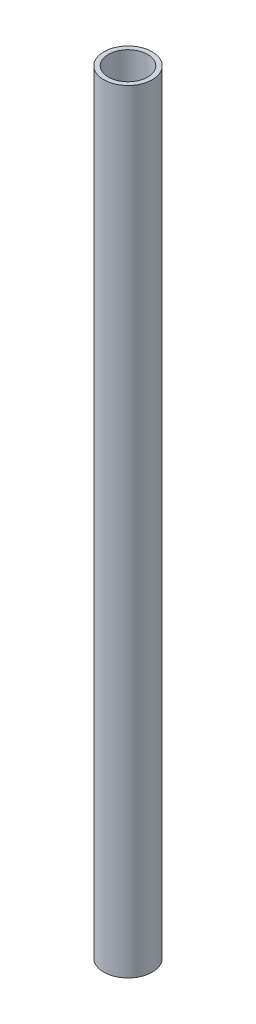
ISO-10303-21;
HEADER;
FILE_DESCRIPTION(('STEP AP214'),'2;1');
FILE_NAME('part.step','',(''),(''),'','','');
FILE_SCHEMA(('AUTOMOTIVE_DESIGN { 1 0 10303 214 1 1 1 1 }'));
ENDSEC;
DATA;
#1=APPLICATION_CONTEXT('core data for automotive mechanical design processes');
#2=APPLICATION_PROTOCOL_DEFINITION('international standard','automotive_design',2000,#1);
#3=PRODUCT_CONTEXT('',#1,'mechanical');
#4=PRODUCT('Part','Part','',(#3));
#5=PRODUCT_RELATED_PRODUCT_CATEGORY('part','',(#4));
#6=PRODUCT_DEFINITION_FORMATION('','',#4);
#7=PRODUCT_DEFINITION_CONTEXT('part definition',#1,'design');
#8=PRODUCT_DEFINITION('design','',#6,#7);
#9=PRODUCT_DEFINITION_SHAPE('','',#8);
#10=(LENGTH_UNIT() NAMED_UNIT(*) SI_UNIT(.MILLI.,.METRE.));
#11=(NAMED_UNIT(*) PLANE_ANGLE_UNIT() SI_UNIT($,.RADIAN.));
#12=(NAMED_UNIT(*) SI_UNIT($,.STERADIAN.) SOLID_ANGLE_UNIT());
#13=UNCERTAINTY_MEASURE_WITH_UNIT(LENGTH_MEASURE(1.E-05),#10,'distance_accuracy_value','');
#14=(GEOMETRIC_REPRESENTATION_CONTEXT(3) GLOBAL_UNCERTAINTY_ASSIGNED_CONTEXT((#13)) GLOBAL_UNIT_ASSIGNED_CONTEXT((#10,
#11,#12)) REPRESENTATION_CONTEXT('',''));
#15=CARTESIAN_POINT('',(0.,0.,0.));
#16=DIRECTION('',(0.,0.,1.));
#17=DIRECTION('',(1.,0.,0.));
#18=AXIS2_PLACEMENT_3D('',#15,#16,#17);
#19=CARTESIAN_POINT('',(2.46348080823466E-11,340.,1.49999999999998));
#20=DIRECTION('',(0.,1.,0.));
#21=DIRECTION('',(0.,0.,1.));
#22=AXIS2_PLACEMENT_3D('',#19,#20,#21);
#23=PLANE('',#22);
#24=CARTESIAN_POINT('',(2.46348080823466E-11,340.,1.49999999999998));
#25=DIRECTION('',(0.,1.,0.));
#26=DIRECTION('',(0.,0.,1.));
#27=AXIS2_PLACEMENT_3D('',#24,#25,#26);
#28=CIRCLE('',#27,10.65);
#29=CARTESIAN_POINT('',(2.46245083785498E-11,340.,-9.15000000000001));
#30=VERTEX_POINT('',#29);
#31=EDGE_CURVE('E12',#30,#30,#28,.T.);
#32=ORIENTED_EDGE('',*,*,#31,.T.);
#33=EDGE_LOOP('',(#32));
#34=FACE_BOUND('',#33,.T.);
#35=CARTESIAN_POINT('',(2.46348080823466E-11,340.,1.49999999999998));
#36=DIRECTION('',(0.,1.,0.));
#37=DIRECTION('',(0.,0.,1.));
#38=AXIS2_PLACEMENT_3D('',#35,#36,#37);
#39=CIRCLE('',#38,8.65);
#40=CARTESIAN_POINT('',(2.46264425952253E-11,340.,-7.15000000000002));
#41=VERTEX_POINT('',#40);
#42=EDGE_CURVE('E60',#41,#41,#39,.T.);
#43=ORIENTED_EDGE('',*,*,#42,.F.);
#44=EDGE_LOOP('',(#43));
#45=FACE_BOUND('',#44,.T.);
#46=ADVANCED_FACE('F46',(#34,#45),#23,.T.);
#47=CARTESIAN_POINT('',(2.45914399954472E-11,0.,1.50000000000002));
#48=DIRECTION('',(0.,1.,0.));
#49=DIRECTION('',(0.,0.,1.));
#50=AXIS2_PLACEMENT_3D('',#47,#48,#49);
#51=PLANE('',#50);
#52=CARTESIAN_POINT('',(2.45914399954472E-11,0.,1.50000000000002));
#53=DIRECTION('',(0.,1.,0.));
#54=DIRECTION('',(0.,0.,1.));
#55=AXIS2_PLACEMENT_3D('',#52,#53,#54);
#56=CIRCLE('',#55,10.65);
#57=CARTESIAN_POINT('',(2.4583777230912E-11,0.,-9.15));
#58=VERTEX_POINT('',#57);
#59=EDGE_CURVE('E50',#58,#58,#56,.T.);
#60=ORIENTED_EDGE('',*,*,#59,.F.);
#61=EDGE_LOOP('',(#60));
#62=FACE_BOUND('',#61,.T.);
#63=CARTESIAN_POINT('',(2.45914399954472E-11,0.,1.50000000000002));
#64=DIRECTION('',(0.,1.,0.));
#65=DIRECTION('',(0.,0.,1.));
#66=AXIS2_PLACEMENT_3D('',#63,#64,#65);
#67=CIRCLE('',#66,8.65);
#68=CARTESIAN_POINT('',(2.45857114475875E-11,0.,-7.15));
#69=VERTEX_POINT('',#68);
#70=EDGE_CURVE('E62',#69,#69,#67,.T.);
#71=ORIENTED_EDGE('',*,*,#70,.T.);
#72=EDGE_LOOP('',(#71));
#73=FACE_BOUND('',#72,.T.);
#74=ADVANCED_FACE('F75',(#62,#73),#51,.F.);
#75=CARTESIAN_POINT('',(2.46348080823466E-11,340.,1.49999999999998));
#76=DIRECTION('',(0.,-1.,0.));
#77=DIRECTION('',(0.,0.,-1.));
#78=AXIS2_PLACEMENT_3D('',#75,#76,#77);
#79=CYLINDRICAL_SURFACE('',#78,10.65);
#80=CARTESIAN_POINT('',(2.46245083785498E-11,340.,-9.15000000000001));
#81=CARTESIAN_POINT('',(2.46240840957619E-11,336.458333333333,-9.15000000000001));
#82=CARTESIAN_POINT('',(2.4623659812974E-11,332.916666666667,-9.15000000000001));
#83=CARTESIAN_POINT('',(2.46228112473983E-11,325.833333333333,-9.15000000000001));
#84=CARTESIAN_POINT('',(2.46223869646104E-11,322.291666666667,-9.15000000000001));
#85=CARTESIAN_POINT('',(2.46215383990346E-11,315.208333333333,-9.15000000000001));
#86=CARTESIAN_POINT('',(2.46211141162467E-11,311.666666666667,-9.15000000000001));
#87=CARTESIAN_POINT('',(2.46202655506709E-11,304.583333333333,-9.15000000000001));
#88=CARTESIAN_POINT('',(2.4619841267883E-11,301.041666666667,-9.15000000000001));
#89=CARTESIAN_POINT('',(2.46189927023072E-11,293.958333333333,-9.15000000000001));
#90=CARTESIAN_POINT('',(2.46185684195193E-11,290.416666666667,-9.15000000000001));
#91=CARTESIAN_POINT('',(2.46177198539435E-11,283.333333333333,-9.15000000000001));
#92=CARTESIAN_POINT('',(2.46172955711556E-11,279.791666666667,-9.15000000000001));
#93=CARTESIAN_POINT('',(2.46164470055799E-11,272.708333333333,-9.15000000000001));
#94=CARTESIAN_POINT('',(2.4616022722792E-11,269.166666666667,-9.15000000000001));
#95=CARTESIAN_POINT('',(2.46151741572162E-11,262.083333333333,-9.15000000000001));
#96=CARTESIAN_POINT('',(2.46147498744283E-11,258.541666666667,-9.15000000000001));
#97=CARTESIAN_POINT('',(2.46139013088525E-11,251.458333333333,-9.15000000000001));
#98=CARTESIAN_POINT('',(2.46134770260646E-11,247.916666666667,-9.15000000000001));
#99=CARTESIAN_POINT('',(2.46126284604888E-11,240.833333333333,-9.15000000000001));
#100=CARTESIAN_POINT('',(2.46122041777009E-11,237.291666666667,-9.15000000000001));
#101=CARTESIAN_POINT('',(2.46113556121251E-11,230.208333333333,-9.15000000000001));
#102=CARTESIAN_POINT('',(2.46109313293372E-11,226.666666666667,-9.15000000000001));
#103=CARTESIAN_POINT('',(2.46100827637614E-11,219.583333333333,-9.15000000000001));
#104=CARTESIAN_POINT('',(2.46096584809735E-11,216.041666666667,-9.15000000000001));
#105=CARTESIAN_POINT('',(2.46088099153978E-11,208.958333333333,-9.15000000000001));
#106=CARTESIAN_POINT('',(2.46083856326099E-11,205.416666666667,-9.15000000000001));
#107=CARTESIAN_POINT('',(2.46075370670341E-11,198.333333333333,-9.15000000000001));
#108=CARTESIAN_POINT('',(2.46071127842462E-11,194.791666666667,-9.15000000000001));
#109=CARTESIAN_POINT('',(2.46062642186704E-11,187.708333333333,-9.15000000000001));
#110=CARTESIAN_POINT('',(2.46058399358825E-11,184.166666666667,-9.15000000000001));
#111=CARTESIAN_POINT('',(2.46049913703067E-11,177.083333333333,-9.15000000000001));
#112=CARTESIAN_POINT('',(2.46045670875188E-11,173.541666666667,-9.15000000000001));
#113=CARTESIAN_POINT('',(2.4603718521943E-11,166.458333333333,-9.15000000000001));
#114=CARTESIAN_POINT('',(2.46032942391551E-11,162.916666666667,-9.15000000000001));
#115=CARTESIAN_POINT('',(2.46024456735794E-11,155.833333333333,-9.15000000000001));
#116=CARTESIAN_POINT('',(2.46020213907915E-11,152.291666666667,-9.15000000000001));
#117=CARTESIAN_POINT('',(2.46011728252157E-11,145.208333333333,-9.15000000000001));
#118=CARTESIAN_POINT('',(2.46007485424278E-11,141.666666666667,-9.15000000000001));
#119=CARTESIAN_POINT('',(2.4599899976852E-11,134.583333333333,-9.15000000000001));
#120=CARTESIAN_POINT('',(2.45994756940641E-11,131.041666666667,-9.15));
#121=CARTESIAN_POINT('',(2.45986271284883E-11,123.958333333333,-9.15));
#122=CARTESIAN_POINT('',(2.45982028457004E-11,120.416666666667,-9.15));
#123=CARTESIAN_POINT('',(2.45973542801246E-11,113.333333333333,-9.15));
#124=CARTESIAN_POINT('',(2.45969299973367E-11,109.791666666667,-9.15));
#125=CARTESIAN_POINT('',(2.45960814317609E-11,102.708333333333,-9.15));
#126=CARTESIAN_POINT('',(2.4595657148973E-11,99.1666666666667,-9.15));
#127=CARTESIAN_POINT('',(2.45948085833973E-11,92.0833333333334,-9.15));
#128=CARTESIAN_POINT('',(2.45943843006094E-11,88.5416666666667,-9.15));
#129=CARTESIAN_POINT('',(2.45935357350336E-11,81.4583333333334,-9.15));
#130=CARTESIAN_POINT('',(2.45931114522457E-11,77.9166666666667,-9.15));
#131=CARTESIAN_POINT('',(2.45922628866699E-11,70.8333333333334,-9.15));
#132=CARTESIAN_POINT('',(2.4591838603882E-11,67.2916666666667,-9.15));
#133=CARTESIAN_POINT('',(2.45909900383062E-11,60.2083333333333,-9.15));
#134=CARTESIAN_POINT('',(2.45905657555183E-11,56.6666666666667,-9.15));
#135=CARTESIAN_POINT('',(2.45897171899425E-11,49.5833333333333,-9.15));
#136=CARTESIAN_POINT('',(2.45892929071546E-11,46.0416666666667,-9.15));
#137=CARTESIAN_POINT('',(2.45884443415789E-11,38.9583333333333,-9.15));
#138=CARTESIAN_POINT('',(2.4588020058791E-11,35.4166666666667,-9.15));
#139=CARTESIAN_POINT('',(2.45871714932152E-11,28.3333333333333,-9.15));
#140=CARTESIAN_POINT('',(2.45867472104273E-11,24.7916666666667,-9.15));
#141=CARTESIAN_POINT('',(2.45858986448515E-11,17.7083333333333,-9.15));
#142=CARTESIAN_POINT('',(2.45854743620636E-11,14.1666666666667,-9.15));
#143=CARTESIAN_POINT('',(2.45846257964878E-11,7.08333333333333,-9.15));
#144=CARTESIAN_POINT('',(2.45842015136999E-11,3.54166666666667,-9.15));
#145=CARTESIAN_POINT('',(2.4583777230912E-11,0.,-9.15));
#146=B_SPLINE_CURVE_WITH_KNOTS('',3,(#80,#81,#82,#83,#84,#85,#86,#87,#88,#89,#90,#91,#92,#93,
#94,#95,#96,#97,#98,#99,#100,#101,#102,#103,#104,#105,#106,#107,#108,#109,#110,#111,#112,#113,
#114,#115,#116,#117,#118,#119,#120,#121,#122,#123,#124,#125,#126,#127,#128,#129,#130,#131,#132,
#133,#134,#135,#136,#137,#138,#139,#140,#141,#142,#143,#144,#145),.UNSPECIFIED.,.F.,.F.,(4,2,2,
2,2,2,2,2,2,2,2,2,2,2,2,2,2,2,2,2,2,2,2,2,2,2,2,2,2,2,2,2,4),(0.,10.625,21.25,31.8749999999999,
42.5,53.125,63.7499999999999,74.375,85.,95.625,106.25,116.875,127.5,138.125,148.75,159.375,170.,
180.625,191.25,201.875,212.5,223.125,233.75,244.375,255.,265.625,276.25,286.875,297.5,308.125,
318.75,329.375,340.),.UNSPECIFIED.);
#147=EDGE_CURVE('BSEAM48',#30,#58,#146,.T.);
#148=ORIENTED_EDGE('',*,*,#31,.F.);
#149=ORIENTED_EDGE('',*,*,#59,.T.);
#150=ORIENTED_EDGE('',*,*,#147,.T.);
#151=ORIENTED_EDGE('',*,*,#147,.F.);
#152=EDGE_LOOP('',(#148,#150,#149,#151));
#153=FACE_BOUND('',#152,.T.);
#154=ADVANCED_FACE('F48',(#153),#79,.T.);
#155=CARTESIAN_POINT('',(2.46348080823466E-11,340.,1.49999999999998));
#156=DIRECTION('',(0.,-1.,0.));
#157=DIRECTION('',(0.,0.,-1.));
#158=AXIS2_PLACEMENT_3D('',#155,#156,#157);
#159=CYLINDRICAL_SURFACE('',#158,8.65);
#160=CARTESIAN_POINT('',(2.46264425952253E-11,340.,-7.15000000000002));
#161=CARTESIAN_POINT('',(2.46260183124374E-11,336.458333333333,-7.15000000000001));
#162=CARTESIAN_POINT('',(2.46255940296495E-11,332.916666666667,-7.15000000000001));
#163=CARTESIAN_POINT('',(2.46247454640737E-11,325.833333333333,-7.15000000000001));
#164=CARTESIAN_POINT('',(2.46243211812858E-11,322.291666666667,-7.15000000000001));
#165=CARTESIAN_POINT('',(2.462347261571E-11,315.208333333333,-7.15000000000001));
#166=CARTESIAN_POINT('',(2.46230483329221E-11,311.666666666667,-7.15000000000001));
#167=CARTESIAN_POINT('',(2.46221997673464E-11,304.583333333333,-7.15000000000001));
#168=CARTESIAN_POINT('',(2.46217754845585E-11,301.041666666667,-7.15000000000001));
#169=CARTESIAN_POINT('',(2.46209269189827E-11,293.958333333333,-7.15000000000001));
#170=CARTESIAN_POINT('',(2.46205026361948E-11,290.416666666667,-7.15000000000001));
#171=CARTESIAN_POINT('',(2.4619654070619E-11,283.333333333333,-7.15000000000001));
#172=CARTESIAN_POINT('',(2.46192297878311E-11,279.791666666667,-7.15000000000001));
#173=CARTESIAN_POINT('',(2.46183812222553E-11,272.708333333333,-7.15000000000001));
#174=CARTESIAN_POINT('',(2.46179569394674E-11,269.166666666667,-7.15000000000001));
#175=CARTESIAN_POINT('',(2.46171083738916E-11,262.083333333333,-7.15000000000001));
#176=CARTESIAN_POINT('',(2.46166840911037E-11,258.541666666667,-7.15000000000001));
#177=CARTESIAN_POINT('',(2.46158355255279E-11,251.458333333333,-7.15000000000001));
#178=CARTESIAN_POINT('',(2.461541124274E-11,247.916666666667,-7.15000000000001));
#179=CARTESIAN_POINT('',(2.46145626771643E-11,240.833333333333,-7.15000000000001));
#180=CARTESIAN_POINT('',(2.46141383943764E-11,237.291666666667,-7.15000000000001));
#181=CARTESIAN_POINT('',(2.46132898288006E-11,230.208333333333,-7.15000000000001));
#182=CARTESIAN_POINT('',(2.46128655460127E-11,226.666666666667,-7.15000000000001));
#183=CARTESIAN_POINT('',(2.46120169804369E-11,219.583333333333,-7.15000000000001));
#184=CARTESIAN_POINT('',(2.4611592697649E-11,216.041666666667,-7.15000000000001));
#185=CARTESIAN_POINT('',(2.46107441320732E-11,208.958333333333,-7.15000000000001));
#186=CARTESIAN_POINT('',(2.46103198492853E-11,205.416666666667,-7.15000000000001));
#187=CARTESIAN_POINT('',(2.46094712837095E-11,198.333333333333,-7.15000000000001));
#188=CARTESIAN_POINT('',(2.46090470009216E-11,194.791666666667,-7.15000000000001));
#189=CARTESIAN_POINT('',(2.46081984353459E-11,187.708333333333,-7.15000000000001));
#190=CARTESIAN_POINT('',(2.4607774152558E-11,184.166666666667,-7.15000000000001));
#191=CARTESIAN_POINT('',(2.46069255869822E-11,177.083333333333,-7.15000000000001));
#192=CARTESIAN_POINT('',(2.46065013041943E-11,173.541666666667,-7.15000000000001));
#193=CARTESIAN_POINT('',(2.46056527386185E-11,166.458333333333,-7.15000000000001));
#194=CARTESIAN_POINT('',(2.46052284558306E-11,162.916666666667,-7.15000000000001));
#195=CARTESIAN_POINT('',(2.46043798902548E-11,155.833333333333,-7.15000000000001));
#196=CARTESIAN_POINT('',(2.46039556074669E-11,152.291666666667,-7.15000000000001));
#197=CARTESIAN_POINT('',(2.46031070418911E-11,145.208333333333,-7.15000000000001));
#198=CARTESIAN_POINT('',(2.46026827591032E-11,141.666666666667,-7.15000000000001));
#199=CARTESIAN_POINT('',(2.46018341935274E-11,134.583333333333,-7.15000000000001));
#200=CARTESIAN_POINT('',(2.46014099107395E-11,131.041666666667,-7.15000000000001));
#201=CARTESIAN_POINT('',(2.46005613451638E-11,123.958333333333,-7.15000000000001));
#202=CARTESIAN_POINT('',(2.46001370623759E-11,120.416666666667,-7.15000000000001));
#203=CARTESIAN_POINT('',(2.45992884968001E-11,113.333333333333,-7.15000000000001));
#204=CARTESIAN_POINT('',(2.45988642140122E-11,109.791666666667,-7.15000000000001));
#205=CARTESIAN_POINT('',(2.45980156484364E-11,102.708333333333,-7.15000000000001));
#206=CARTESIAN_POINT('',(2.45975913656485E-11,99.1666666666667,-7.15));
#207=CARTESIAN_POINT('',(2.45967428000727E-11,92.0833333333334,-7.15));
#208=CARTESIAN_POINT('',(2.45963185172848E-11,88.5416666666667,-7.15));
#209=CARTESIAN_POINT('',(2.4595469951709E-11,81.4583333333334,-7.15));
#210=CARTESIAN_POINT('',(2.45950456689211E-11,77.9166666666667,-7.15));
#211=CARTESIAN_POINT('',(2.45941971033454E-11,70.8333333333334,-7.15));
#212=CARTESIAN_POINT('',(2.45937728205575E-11,67.2916666666667,-7.15));
#213=CARTESIAN_POINT('',(2.45929242549817E-11,60.2083333333333,-7.15));
#214=CARTESIAN_POINT('',(2.45924999721938E-11,56.6666666666667,-7.15));
#215=CARTESIAN_POINT('',(2.4591651406618E-11,49.5833333333333,-7.15));
#216=CARTESIAN_POINT('',(2.45912271238301E-11,46.0416666666667,-7.15));
#217=CARTESIAN_POINT('',(2.45903785582543E-11,38.9583333333333,-7.15));
#218=CARTESIAN_POINT('',(2.45899542754664E-11,35.4166666666667,-7.15));
#219=CARTESIAN_POINT('',(2.45891057098906E-11,28.3333333333333,-7.15));
#220=CARTESIAN_POINT('',(2.45886814271027E-11,24.7916666666667,-7.15));
#221=CARTESIAN_POINT('',(2.45878328615269E-11,17.7083333333333,-7.15));
#222=CARTESIAN_POINT('',(2.45874085787391E-11,14.1666666666667,-7.15));
#223=CARTESIAN_POINT('',(2.45865600131633E-11,7.08333333333333,-7.15));
#224=CARTESIAN_POINT('',(2.45861357303754E-11,3.54166666666667,-7.15));
#225=CARTESIAN_POINT('',(2.45857114475875E-11,0.,-7.15));
#226=B_SPLINE_CURVE_WITH_KNOTS('',3,(#160,#161,#162,#163,#164,#165,#166,#167,#168,#169,#170,
#171,#172,#173,#174,#175,#176,#177,#178,#179,#180,#181,#182,#183,#184,#185,#186,#187,#188,#189,
#190,#191,#192,#193,#194,#195,#196,#197,#198,#199,#200,#201,#202,#203,#204,#205,#206,#207,#208,
#209,#210,#211,#212,#213,#214,#215,#216,#217,#218,#219,#220,#221,#222,#223,#224,#225),
.UNSPECIFIED.,.F.,.F.,(4,2,2,2,2,2,2,2,2,2,2,2,2,2,2,2,2,2,2,2,2,2,2,2,2,2,2,2,2,2,2,2,4),(0.,
10.625,21.25,31.8749999999999,42.5,53.125,63.7499999999999,74.375,85.,95.625,106.25,116.875,
127.5,138.125,148.75,159.375,170.,180.625,191.25,201.875,212.5,223.125,233.75,244.375,255.,
265.625,276.25,286.875,297.5,308.125,318.75,329.375,340.),.UNSPECIFIED.);
#227=EDGE_CURVE('BSEAM71',#41,#69,#226,.T.);
#228=ORIENTED_EDGE('',*,*,#42,.T.);
#229=ORIENTED_EDGE('',*,*,#70,.F.);
#230=ORIENTED_EDGE('',*,*,#227,.T.);
#231=ORIENTED_EDGE('',*,*,#227,.F.);
#232=EDGE_LOOP('',(#228,#230,#229,#231));
#233=FACE_BOUND('',#232,.T.);
#234=ADVANCED_FACE('F71',(#233),#159,.F.);
#235=CLOSED_SHELL('',(#46,#74,#154,#234));
#236=MANIFOLD_SOLID_BREP('B2',#235);
#237=ADVANCED_BREP_SHAPE_REPRESENTATION('',(#18,#236),#14);
#238=SHAPE_DEFINITION_REPRESENTATION(#9,#237);
ENDSEC;
END-ISO-10303-21;
